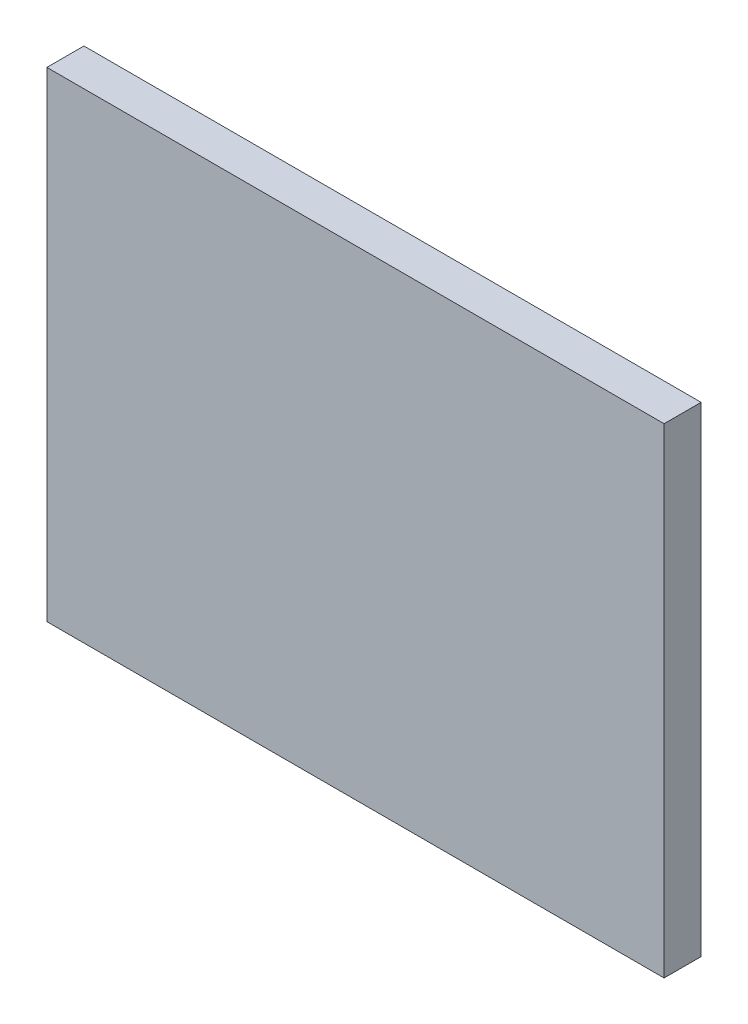
ISO-10303-21;
HEADER;
FILE_DESCRIPTION(('STEP AP214'),'2;1');
FILE_NAME('part.step','',(''),(''),'','','');
FILE_SCHEMA(('AUTOMOTIVE_DESIGN { 1 0 10303 214 1 1 1 1 }'));
ENDSEC;
DATA;
#1=APPLICATION_CONTEXT('core data for automotive mechanical design processes');
#2=APPLICATION_PROTOCOL_DEFINITION('international standard','automotive_design',2000,#1);
#3=PRODUCT_CONTEXT('',#1,'mechanical');
#4=PRODUCT('Part','Part','',(#3));
#5=PRODUCT_RELATED_PRODUCT_CATEGORY('part','',(#4));
#6=PRODUCT_DEFINITION_FORMATION('','',#4);
#7=PRODUCT_DEFINITION_CONTEXT('part definition',#1,'design');
#8=PRODUCT_DEFINITION('design','',#6,#7);
#9=PRODUCT_DEFINITION_SHAPE('','',#8);
#10=(LENGTH_UNIT() NAMED_UNIT(*) SI_UNIT(.MILLI.,.METRE.));
#11=(NAMED_UNIT(*) PLANE_ANGLE_UNIT() SI_UNIT($,.RADIAN.));
#12=(NAMED_UNIT(*) SI_UNIT($,.STERADIAN.) SOLID_ANGLE_UNIT());
#13=UNCERTAINTY_MEASURE_WITH_UNIT(LENGTH_MEASURE(1.E-05),#10,'distance_accuracy_value','');
#14=(GEOMETRIC_REPRESENTATION_CONTEXT(3) GLOBAL_UNCERTAINTY_ASSIGNED_CONTEXT((#13)) GLOBAL_UNIT_ASSIGNED_CONTEXT((#10,
#11,#12)) REPRESENTATION_CONTEXT('',''));
#15=CARTESIAN_POINT('',(0.,0.,0.));
#16=DIRECTION('',(0.,0.,1.));
#17=DIRECTION('',(1.,0.,0.));
#18=AXIS2_PLACEMENT_3D('',#15,#16,#17);
#19=CARTESIAN_POINT('',(2.25000058,1.74999904,0.26999946));
#20=DIRECTION('',(0.,0.,-1.));
#21=DIRECTION('',(-1.,0.,0.));
#22=AXIS2_PLACEMENT_3D('',#19,#20,#21);
#23=PLANE('',#22);
#24=DIRECTION('',(0.,1.,0.));
#25=VECTOR('',#24,1.);
#26=CARTESIAN_POINT('',(-2.24999804,1.74999904,0.26999946));
#27=LINE('',#26,#25);
#28=CARTESIAN_POINT('',(-2.24999804,1.74999904,0.26999946));
#29=VERTEX_POINT('',#28);
#30=CARTESIAN_POINT('',(-2.24999804,-1.74999904,0.26999946));
#31=VERTEX_POINT('',#30);
#32=EDGE_CURVE('E55',#29,#31,#27,.F.);
#33=ORIENTED_EDGE('',*,*,#32,.T.);
#34=DIRECTION('',(1.,0.,0.));
#35=VECTOR('',#34,1.);
#36=CARTESIAN_POINT('',(-2.24999804,-1.74999904,0.26999946));
#37=LINE('',#36,#35);
#38=CARTESIAN_POINT('',(2.25000058,-1.74999904,0.26999946));
#39=VERTEX_POINT('',#38);
#40=EDGE_CURVE('E57',#31,#39,#37,.T.);
#41=ORIENTED_EDGE('',*,*,#40,.T.);
#42=DIRECTION('',(0.,1.,0.));
#43=VECTOR('',#42,1.);
#44=CARTESIAN_POINT('',(2.25000058,-1.74999904,0.26999946));
#45=LINE('',#44,#43);
#46=CARTESIAN_POINT('',(2.25000058,1.74999904,0.26999946));
#47=VERTEX_POINT('',#46);
#48=EDGE_CURVE('E20',#39,#47,#45,.T.);
#49=ORIENTED_EDGE('',*,*,#48,.T.);
#50=DIRECTION('',(1.,0.,0.));
#51=VECTOR('',#50,1.);
#52=CARTESIAN_POINT('',(2.25000058,1.74999904,0.26999946));
#53=LINE('',#52,#51);
#54=EDGE_CURVE('E80',#47,#29,#53,.F.);
#55=ORIENTED_EDGE('',*,*,#54,.T.);
#56=EDGE_LOOP('',(#33,#41,#49,#55));
#57=FACE_BOUND('',#56,.T.);
#58=ADVANCED_FACE('F17',(#57),#23,.F.);
#59=CARTESIAN_POINT('',(2.25000058,-1.74999904,0.));
#60=DIRECTION('',(-1.,0.,0.));
#61=DIRECTION('',(0.,0.,1.));
#62=AXIS2_PLACEMENT_3D('',#59,#60,#61);
#63=PLANE('',#62);
#64=DIRECTION('',(0.,0.,-1.));
#65=VECTOR('',#64,1.);
#66=CARTESIAN_POINT('',(2.25000058,1.74999904,0.));
#67=LINE('',#66,#65);
#68=CARTESIAN_POINT('',(2.25000058,1.74999904,0.));
#69=VERTEX_POINT('',#68);
#70=EDGE_CURVE('E68',#69,#47,#67,.F.);
#71=ORIENTED_EDGE('',*,*,#70,.T.);
#72=ORIENTED_EDGE('',*,*,#48,.F.);
#73=DIRECTION('',(0.,0.,1.));
#74=VECTOR('',#73,1.);
#75=CARTESIAN_POINT('',(2.25000058,-1.74999904,0.));
#76=LINE('',#75,#74);
#77=CARTESIAN_POINT('',(2.25000058,-1.74999904,0.));
#78=VERTEX_POINT('',#77);
#79=EDGE_CURVE('E63',#39,#78,#76,.F.);
#80=ORIENTED_EDGE('',*,*,#79,.T.);
#81=DIRECTION('',(0.,1.,0.));
#82=VECTOR('',#81,1.);
#83=CARTESIAN_POINT('',(2.25000058,1.74999904,0.));
#84=LINE('',#83,#82);
#85=EDGE_CURVE('E83',#69,#78,#84,.F.);
#86=ORIENTED_EDGE('',*,*,#85,.F.);
#87=EDGE_LOOP('',(#71,#72,#80,#86));
#88=FACE_BOUND('',#87,.T.);
#89=ADVANCED_FACE('F65',(#88),#63,.F.);
#90=CARTESIAN_POINT('',(-2.24999804,-1.74999904,0.));
#91=DIRECTION('',(0.,1.,0.));
#92=DIRECTION('',(0.,0.,1.));
#93=AXIS2_PLACEMENT_3D('',#90,#91,#92);
#94=PLANE('',#93);
#95=ORIENTED_EDGE('',*,*,#79,.F.);
#96=ORIENTED_EDGE('',*,*,#40,.F.);
#97=DIRECTION('',(0.,0.,-1.));
#98=VECTOR('',#97,1.);
#99=CARTESIAN_POINT('',(-2.24999804,-1.74999904,0.));
#100=LINE('',#99,#98);
#101=CARTESIAN_POINT('',(-2.24999804,-1.74999904,0.));
#102=VERTEX_POINT('',#101);
#103=EDGE_CURVE('E75',#31,#102,#100,.T.);
#104=ORIENTED_EDGE('',*,*,#103,.T.);
#105=DIRECTION('',(-1.,0.,0.));
#106=VECTOR('',#105,1.);
#107=CARTESIAN_POINT('',(2.25000058,-1.74999904,0.));
#108=LINE('',#107,#106);
#109=EDGE_CURVE('E72',#78,#102,#108,.T.);
#110=ORIENTED_EDGE('',*,*,#109,.F.);
#111=EDGE_LOOP('',(#95,#96,#104,#110));
#112=FACE_BOUND('',#111,.T.);
#113=ADVANCED_FACE('F70',(#112),#94,.F.);
#114=CARTESIAN_POINT('',(-2.24999804,1.74999904,0.));
#115=DIRECTION('',(1.,0.,0.));
#116=DIRECTION('',(0.,0.,-1.));
#117=AXIS2_PLACEMENT_3D('',#114,#115,#116);
#118=PLANE('',#117);
#119=ORIENTED_EDGE('',*,*,#103,.F.);
#120=ORIENTED_EDGE('',*,*,#32,.F.);
#121=DIRECTION('',(0.,0.,-1.));
#122=VECTOR('',#121,1.);
#123=CARTESIAN_POINT('',(-2.24999804,1.74999904,0.));
#124=LINE('',#123,#122);
#125=CARTESIAN_POINT('',(-2.24999804,1.74999904,0.));
#126=VERTEX_POINT('',#125);
#127=EDGE_CURVE('E35',#29,#126,#124,.T.);
#128=ORIENTED_EDGE('',*,*,#127,.T.);
#129=DIRECTION('',(0.,1.,0.));
#130=VECTOR('',#129,1.);
#131=CARTESIAN_POINT('',(-2.24999804,1.74999904,0.));
#132=LINE('',#131,#130);
#133=EDGE_CURVE('E26',#102,#126,#132,.T.);
#134=ORIENTED_EDGE('',*,*,#133,.F.);
#135=EDGE_LOOP('',(#119,#120,#128,#134));
#136=FACE_BOUND('',#135,.T.);
#137=ADVANCED_FACE('F89',(#136),#118,.F.);
#138=CARTESIAN_POINT('',(2.25000058,1.74999904,0.));
#139=DIRECTION('',(0.,-1.,0.));
#140=DIRECTION('',(0.,0.,-1.));
#141=AXIS2_PLACEMENT_3D('',#138,#139,#140);
#142=PLANE('',#141);
#143=ORIENTED_EDGE('',*,*,#127,.F.);
#144=ORIENTED_EDGE('',*,*,#54,.F.);
#145=ORIENTED_EDGE('',*,*,#70,.F.);
#146=DIRECTION('',(-1.,0.,0.));
#147=VECTOR('',#146,1.);
#148=CARTESIAN_POINT('',(2.25000058,1.74999904,0.));
#149=LINE('',#148,#147);
#150=EDGE_CURVE('E11',#126,#69,#149,.F.);
#151=ORIENTED_EDGE('',*,*,#150,.F.);
#152=EDGE_LOOP('',(#143,#144,#145,#151));
#153=FACE_BOUND('',#152,.T.);
#154=ADVANCED_FACE('F91',(#153),#142,.F.);
#155=CARTESIAN_POINT('',(2.25000058,1.74999904,0.));
#156=DIRECTION('',(0.,0.,-1.));
#157=DIRECTION('',(-1.,0.,0.));
#158=AXIS2_PLACEMENT_3D('',#155,#156,#157);
#159=PLANE('',#158);
#160=ORIENTED_EDGE('',*,*,#133,.T.);
#161=ORIENTED_EDGE('',*,*,#150,.T.);
#162=ORIENTED_EDGE('',*,*,#85,.T.);
#163=ORIENTED_EDGE('',*,*,#109,.T.);
#164=EDGE_LOOP('',(#160,#161,#162,#163));
#165=FACE_BOUND('',#164,.T.);
#166=ADVANCED_FACE('F88',(#165),#159,.T.);
#167=CLOSED_SHELL('',(#58,#89,#113,#137,#154,#166));
#168=MANIFOLD_SOLID_BREP('B1',#167);
#169=ADVANCED_BREP_SHAPE_REPRESENTATION('',(#18,#168),#14);
#170=SHAPE_DEFINITION_REPRESENTATION(#9,#169);
ENDSEC;
END-ISO-10303-21;
